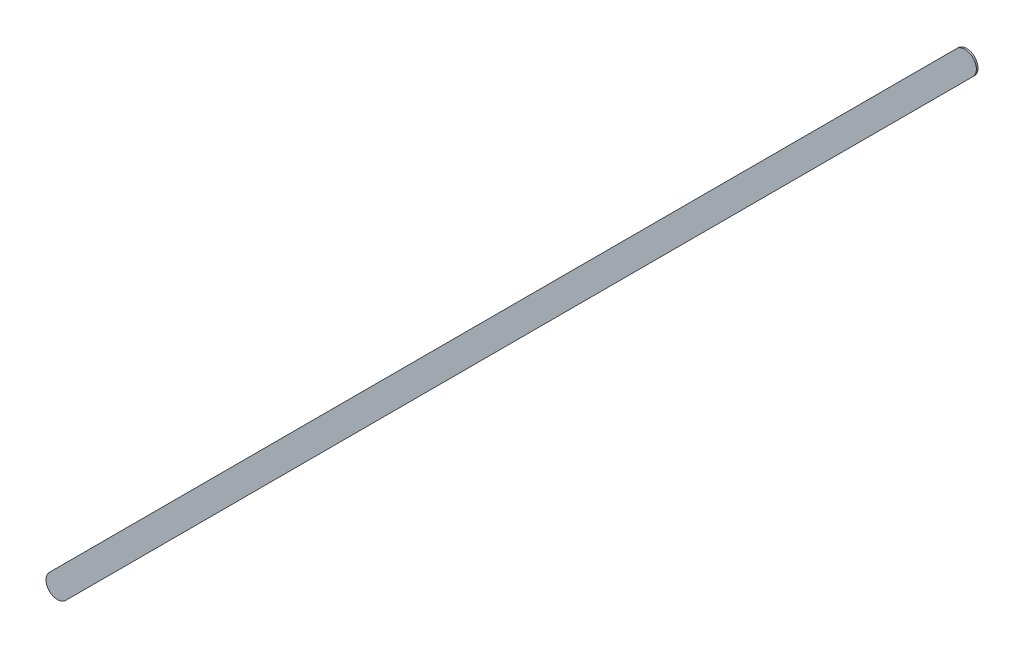
ISO-10303-21;
HEADER;
FILE_DESCRIPTION(('STEP AP214'),'2;1');
FILE_NAME('part.step','',(''),(''),'','','');
FILE_SCHEMA(('AUTOMOTIVE_DESIGN { 1 0 10303 214 1 1 1 1 }'));
ENDSEC;
DATA;
#1=APPLICATION_CONTEXT('core data for automotive mechanical design processes');
#2=APPLICATION_PROTOCOL_DEFINITION('international standard','automotive_design',2000,#1);
#3=PRODUCT_CONTEXT('',#1,'mechanical');
#4=PRODUCT('Part','Part','',(#3));
#5=PRODUCT_RELATED_PRODUCT_CATEGORY('part','',(#4));
#6=PRODUCT_DEFINITION_FORMATION('','',#4);
#7=PRODUCT_DEFINITION_CONTEXT('part definition',#1,'design');
#8=PRODUCT_DEFINITION('design','',#6,#7);
#9=PRODUCT_DEFINITION_SHAPE('','',#8);
#10=(LENGTH_UNIT() NAMED_UNIT(*) SI_UNIT(.MILLI.,.METRE.));
#11=(NAMED_UNIT(*) PLANE_ANGLE_UNIT() SI_UNIT($,.RADIAN.));
#12=(NAMED_UNIT(*) SI_UNIT($,.STERADIAN.) SOLID_ANGLE_UNIT());
#13=UNCERTAINTY_MEASURE_WITH_UNIT(LENGTH_MEASURE(1.E-05),#10,'distance_accuracy_value','');
#14=(GEOMETRIC_REPRESENTATION_CONTEXT(3) GLOBAL_UNCERTAINTY_ASSIGNED_CONTEXT((#13)) GLOBAL_UNIT_ASSIGNED_CONTEXT((#10,
#11,#12)) REPRESENTATION_CONTEXT('',''));
#15=CARTESIAN_POINT('',(0.,0.,0.));
#16=DIRECTION('',(0.,0.,1.));
#17=DIRECTION('',(1.,0.,0.));
#18=AXIS2_PLACEMENT_3D('',#15,#16,#17);
#19=CARTESIAN_POINT('',(57.99677758,90.74322466,0.));
#20=DIRECTION('',(-0.707106781186547,0.707106781186548,0.));
#21=DIRECTION('',(0.707106781186548,0.707106781186547,0.));
#22=AXIS2_PLACEMENT_3D('',#19,#20,#21);
#23=PLANE('',#22);
#24=DIRECTION('',(0.707106781186548,0.707106781186547,0.));
#25=VECTOR('',#24,1.);
#26=CARTESIAN_POINT('',(57.99677758,90.74322466,0.03556));
#27=LINE('',#26,#25);
#28=CARTESIAN_POINT('',(57.99677758,90.74322466,0.03556));
#29=VERTEX_POINT('',#28);
#30=CARTESIAN_POINT('',(77.74457654,110.49102362,0.03556));
#31=VERTEX_POINT('',#30);
#32=EDGE_CURVE('E11',#29,#31,#27,.T.);
#33=ORIENTED_EDGE('',*,*,#32,.F.);
#34=DIRECTION('',(0.,0.,1.));
#35=VECTOR('',#34,1.);
#36=CARTESIAN_POINT('',(57.99677758,90.74322466,0.));
#37=LINE('',#36,#35);
#38=CARTESIAN_POINT('',(57.99677758,90.74322466,0.));
#39=VERTEX_POINT('',#38);
#40=EDGE_CURVE('E24',#39,#29,#37,.T.);
#41=ORIENTED_EDGE('',*,*,#40,.F.);
#42=DIRECTION('',(0.707106781186548,0.707106781186547,0.));
#43=VECTOR('',#42,1.);
#44=CARTESIAN_POINT('',(57.99677758,90.74322466,0.));
#45=LINE('',#44,#43);
#46=CARTESIAN_POINT('',(77.74457654,110.49102362,0.));
#47=VERTEX_POINT('',#46);
#48=EDGE_CURVE('E75',#39,#47,#45,.T.);
#49=ORIENTED_EDGE('',*,*,#48,.T.);
#50=DIRECTION('',(0.,0.,1.));
#51=VECTOR('',#50,1.);
#52=CARTESIAN_POINT('',(77.74457654,110.49102362,0.));
#53=LINE('',#52,#51);
#54=EDGE_CURVE('E37',#47,#31,#53,.T.);
#55=ORIENTED_EDGE('',*,*,#54,.T.);
#56=EDGE_LOOP('',(#33,#41,#49,#55));
#57=FACE_BOUND('',#56,.T.);
#58=ADVANCED_FACE('F17',(#57),#23,.F.);
#59=CARTESIAN_POINT('',(77.56780016,110.6678,0.));
#60=DIRECTION('',(0.,0.,-1.));
#61=DIRECTION('',(0.707106781186576,-0.707106781186519,0.));
#62=AXIS2_PLACEMENT_3D('',#59,#60,#61);
#63=CYLINDRICAL_SURFACE('',#62,0.249999554103216);
#64=CARTESIAN_POINT('',(77.56780016,110.6678,0.03556));
#65=DIRECTION('',(0.,0.,1.));
#66=DIRECTION('',(0.707106781186576,-0.707106781186519,0.));
#67=AXIS2_PLACEMENT_3D('',#64,#65,#66);
#68=CIRCLE('',#67,0.249999554103216);
#69=CARTESIAN_POINT('',(77.39102378,110.84457638,0.03556));
#70=VERTEX_POINT('',#69);
#71=EDGE_CURVE('E83',#31,#70,#68,.T.);
#72=ORIENTED_EDGE('',*,*,#71,.F.);
#73=ORIENTED_EDGE('',*,*,#54,.F.);
#74=CARTESIAN_POINT('',(77.56780016,110.6678,0.));
#75=DIRECTION('',(0.,0.,1.));
#76=DIRECTION('',(0.707106781186576,-0.707106781186519,0.));
#77=AXIS2_PLACEMENT_3D('',#74,#75,#76);
#78=CIRCLE('',#77,0.249999554103216);
#79=CARTESIAN_POINT('',(77.39102378,110.84457638,0.));
#80=VERTEX_POINT('',#79);
#81=EDGE_CURVE('E81',#47,#80,#78,.T.);
#82=ORIENTED_EDGE('',*,*,#81,.T.);
#83=DIRECTION('',(0.,0.,1.));
#84=VECTOR('',#83,1.);
#85=CARTESIAN_POINT('',(77.39102378,110.84457638,0.));
#86=LINE('',#85,#84);
#87=EDGE_CURVE('E67',#80,#70,#86,.T.);
#88=ORIENTED_EDGE('',*,*,#87,.T.);
#89=EDGE_LOOP('',(#72,#73,#82,#88));
#90=FACE_BOUND('',#89,.T.);
#91=ADVANCED_FACE('F89',(#90),#63,.T.);
#92=CARTESIAN_POINT('',(77.39102378,110.84457638,0.));
#93=DIRECTION('',(0.707106781186547,-0.707106781186548,0.));
#94=DIRECTION('',(-0.707106781186548,-0.707106781186547,0.));
#95=AXIS2_PLACEMENT_3D('',#92,#93,#94);
#96=PLANE('',#95);
#97=DIRECTION('',(-0.707106781186548,-0.707106781186547,0.));
#98=VECTOR('',#97,1.);
#99=CARTESIAN_POINT('',(77.39102378,110.84457638,0.03556));
#100=LINE('',#99,#98);
#101=CARTESIAN_POINT('',(57.64322482,91.09677742,0.03556));
#102=VERTEX_POINT('',#101);
#103=EDGE_CURVE('E71',#70,#102,#100,.T.);
#104=ORIENTED_EDGE('',*,*,#103,.F.);
#105=ORIENTED_EDGE('',*,*,#87,.F.);
#106=DIRECTION('',(-0.707106781186548,-0.707106781186547,0.));
#107=VECTOR('',#106,1.);
#108=CARTESIAN_POINT('',(77.39102378,110.84457638,0.));
#109=LINE('',#108,#107);
#110=CARTESIAN_POINT('',(57.64322482,91.09677742,0.));
#111=VERTEX_POINT('',#110);
#112=EDGE_CURVE('E63',#80,#111,#109,.T.);
#113=ORIENTED_EDGE('',*,*,#112,.T.);
#114=DIRECTION('',(0.,0.,1.));
#115=VECTOR('',#114,1.);
#116=CARTESIAN_POINT('',(57.64322482,91.09677742,0.));
#117=LINE('',#116,#115);
#118=EDGE_CURVE('E53',#111,#102,#117,.T.);
#119=ORIENTED_EDGE('',*,*,#118,.T.);
#120=EDGE_LOOP('',(#104,#105,#113,#119));
#121=FACE_BOUND('',#120,.T.);
#122=ADVANCED_FACE('F66',(#121),#96,.F.);
#123=CARTESIAN_POINT('',(57.8200012,90.92000104,0.));
#124=DIRECTION('',(0.,0.,-1.));
#125=DIRECTION('',(-0.707106781186519,0.707106781186576,0.));
#126=AXIS2_PLACEMENT_3D('',#123,#124,#125);
#127=CYLINDRICAL_SURFACE('',#126,0.249999554103215);
#128=CARTESIAN_POINT('',(57.8200012,90.92000104,0.03556));
#129=DIRECTION('',(0.,0.,1.));
#130=DIRECTION('',(-0.707106781186519,0.707106781186576,0.));
#131=AXIS2_PLACEMENT_3D('',#128,#129,#130);
#132=CIRCLE('',#131,0.249999554103215);
#133=EDGE_CURVE('E59',#102,#29,#132,.T.);
#134=ORIENTED_EDGE('',*,*,#133,.F.);
#135=ORIENTED_EDGE('',*,*,#118,.F.);
#136=CARTESIAN_POINT('',(57.8200012,90.92000104,0.));
#137=DIRECTION('',(0.,0.,1.));
#138=DIRECTION('',(-0.707106781186519,0.707106781186576,0.));
#139=AXIS2_PLACEMENT_3D('',#136,#137,#138);
#140=CIRCLE('',#139,0.249999554103215);
#141=EDGE_CURVE('E57',#111,#39,#140,.T.);
#142=ORIENTED_EDGE('',*,*,#141,.T.);
#143=ORIENTED_EDGE('',*,*,#40,.T.);
#144=EDGE_LOOP('',(#134,#135,#142,#143));
#145=FACE_BOUND('',#144,.T.);
#146=ADVANCED_FACE('F55',(#145),#127,.T.);
#147=CARTESIAN_POINT('',(57.99677758,90.74322466,0.));
#148=DIRECTION('',(0.,0.,-1.));
#149=DIRECTION('',(-1.,0.,0.));
#150=AXIS2_PLACEMENT_3D('',#147,#148,#149);
#151=PLANE('',#150);
#152=ORIENTED_EDGE('',*,*,#141,.F.);
#153=ORIENTED_EDGE('',*,*,#112,.F.);
#154=ORIENTED_EDGE('',*,*,#81,.F.);
#155=ORIENTED_EDGE('',*,*,#48,.F.);
#156=EDGE_LOOP('',(#152,#153,#154,#155));
#157=FACE_BOUND('',#156,.T.);
#158=ADVANCED_FACE('F74',(#157),#151,.T.);
#159=CARTESIAN_POINT('',(57.99677758,90.74322466,0.03556));
#160=DIRECTION('',(0.,0.,-1.));
#161=DIRECTION('',(-1.,0.,0.));
#162=AXIS2_PLACEMENT_3D('',#159,#160,#161);
#163=PLANE('',#162);
#164=ORIENTED_EDGE('',*,*,#32,.T.);
#165=ORIENTED_EDGE('',*,*,#71,.T.);
#166=ORIENTED_EDGE('',*,*,#103,.T.);
#167=ORIENTED_EDGE('',*,*,#133,.T.);
#168=EDGE_LOOP('',(#164,#165,#166,#167));
#169=FACE_BOUND('',#168,.T.);
#170=ADVANCED_FACE('F91',(#169),#163,.F.);
#171=CLOSED_SHELL('',(#58,#91,#122,#146,#158,#170));
#172=MANIFOLD_SOLID_BREP('B1',#171);
#173=ADVANCED_BREP_SHAPE_REPRESENTATION('',(#18,#172),#14);
#174=SHAPE_DEFINITION_REPRESENTATION(#9,#173);
ENDSEC;
END-ISO-10303-21;
